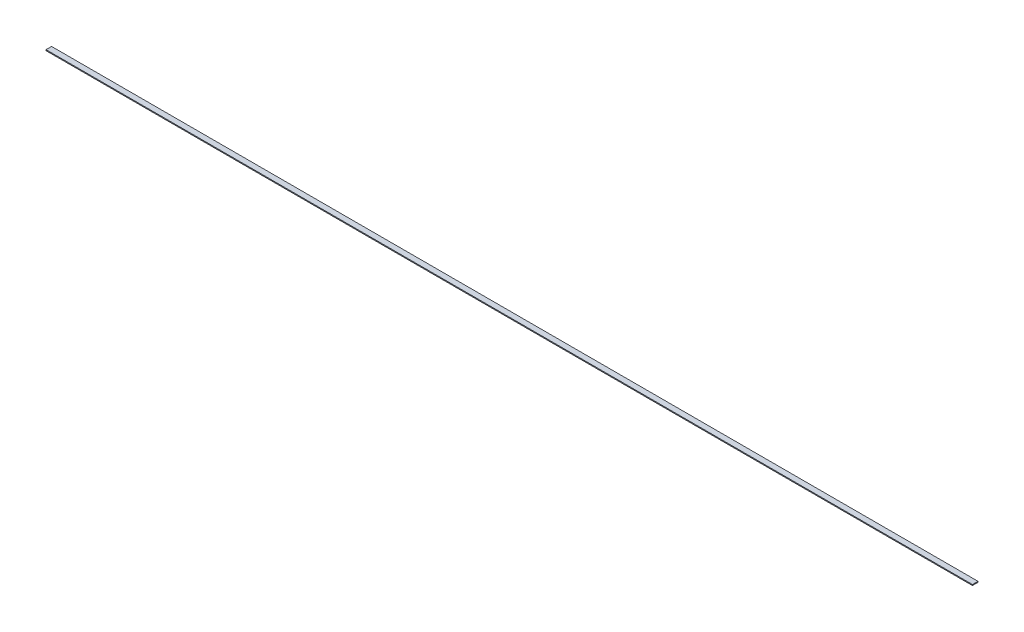
ISO-10303-21;
HEADER;
FILE_DESCRIPTION(('STEP AP214'),'2;1');
FILE_NAME('part.step','',(''),(''),'','','');
FILE_SCHEMA(('AUTOMOTIVE_DESIGN { 1 0 10303 214 1 1 1 1 }'));
ENDSEC;
DATA;
#1=APPLICATION_CONTEXT('core data for automotive mechanical design processes');
#2=APPLICATION_PROTOCOL_DEFINITION('international standard','automotive_design',2000,#1);
#3=PRODUCT_CONTEXT('',#1,'mechanical');
#4=PRODUCT('Part','Part','',(#3));
#5=PRODUCT_RELATED_PRODUCT_CATEGORY('part','',(#4));
#6=PRODUCT_DEFINITION_FORMATION('','',#4);
#7=PRODUCT_DEFINITION_CONTEXT('part definition',#1,'design');
#8=PRODUCT_DEFINITION('design','',#6,#7);
#9=PRODUCT_DEFINITION_SHAPE('','',#8);
#10=(LENGTH_UNIT() NAMED_UNIT(*) SI_UNIT(.MILLI.,.METRE.));
#11=(NAMED_UNIT(*) PLANE_ANGLE_UNIT() SI_UNIT($,.RADIAN.));
#12=(NAMED_UNIT(*) SI_UNIT($,.STERADIAN.) SOLID_ANGLE_UNIT());
#13=UNCERTAINTY_MEASURE_WITH_UNIT(LENGTH_MEASURE(1.E-05),#10,'distance_accuracy_value','');
#14=(GEOMETRIC_REPRESENTATION_CONTEXT(3) GLOBAL_UNCERTAINTY_ASSIGNED_CONTEXT((#13)) GLOBAL_UNIT_ASSIGNED_CONTEXT((#10,
#11,#12)) REPRESENTATION_CONTEXT('',''));
#15=CARTESIAN_POINT('',(0.,0.,0.));
#16=DIRECTION('',(0.,0.,1.));
#17=DIRECTION('',(1.,0.,0.));
#18=AXIS2_PLACEMENT_3D('',#15,#16,#17);
#19=CARTESIAN_POINT('',(0.,0.,6.));
#20=DIRECTION('',(1.,0.,0.));
#21=DIRECTION('',(0.,0.,-1.));
#22=AXIS2_PLACEMENT_3D('',#19,#20,#21);
#23=PLANE('',#22);
#24=DIRECTION('',(0.,-1.,0.));
#25=VECTOR('',#24,1.);
#26=CARTESIAN_POINT('',(0.,0.,0.));
#27=LINE('',#26,#25);
#28=CARTESIAN_POINT('',(0.,1.,0.));
#29=VERTEX_POINT('',#28);
#30=CARTESIAN_POINT('',(0.,0.,0.));
#31=VERTEX_POINT('',#30);
#32=EDGE_CURVE('E96',#29,#31,#27,.T.);
#33=ORIENTED_EDGE('',*,*,#32,.T.);
#34=DIRECTION('',(0.,0.,-1.));
#35=VECTOR('',#34,1.);
#36=CARTESIAN_POINT('',(0.,0.,6.));
#37=LINE('',#36,#35);
#38=CARTESIAN_POINT('',(0.,0.,6.));
#39=VERTEX_POINT('',#38);
#40=EDGE_CURVE('E11',#39,#31,#37,.T.);
#41=ORIENTED_EDGE('',*,*,#40,.F.);
#42=DIRECTION('',(0.,-1.,0.));
#43=VECTOR('',#42,1.);
#44=CARTESIAN_POINT('',(0.,0.,6.));
#45=LINE('',#44,#43);
#46=CARTESIAN_POINT('',(0.,1.,6.));
#47=VERTEX_POINT('',#46);
#48=EDGE_CURVE('E84',#47,#39,#45,.T.);
#49=ORIENTED_EDGE('',*,*,#48,.F.);
#50=DIRECTION('',(0.,0.,-1.));
#51=VECTOR('',#50,1.);
#52=CARTESIAN_POINT('',(0.,1.,6.));
#53=LINE('',#52,#51);
#54=EDGE_CURVE('E92',#47,#29,#53,.T.);
#55=ORIENTED_EDGE('',*,*,#54,.T.);
#56=EDGE_LOOP('',(#33,#41,#49,#55));
#57=FACE_BOUND('',#56,.T.);
#58=ADVANCED_FACE('F33',(#57),#23,.F.);
#59=CARTESIAN_POINT('',(0.,0.,6.));
#60=DIRECTION('',(0.,1.,0.));
#61=DIRECTION('',(0.,0.,1.));
#62=AXIS2_PLACEMENT_3D('',#59,#60,#61);
#63=PLANE('',#62);
#64=DIRECTION('',(1.,0.,0.));
#65=VECTOR('',#64,1.);
#66=CARTESIAN_POINT('',(0.,0.,0.));
#67=LINE('',#66,#65);
#68=CARTESIAN_POINT('',(1000.,0.,0.));
#69=VERTEX_POINT('',#68);
#70=EDGE_CURVE('E88',#31,#69,#67,.T.);
#71=ORIENTED_EDGE('',*,*,#70,.T.);
#72=DIRECTION('',(0.,0.,-1.));
#73=VECTOR('',#72,1.);
#74=CARTESIAN_POINT('',(1000.,0.,6.));
#75=LINE('',#74,#73);
#76=CARTESIAN_POINT('',(1000.,0.,6.));
#77=VERTEX_POINT('',#76);
#78=EDGE_CURVE('E41',#77,#69,#75,.T.);
#79=ORIENTED_EDGE('',*,*,#78,.F.);
#80=DIRECTION('',(1.,0.,0.));
#81=VECTOR('',#80,1.);
#82=CARTESIAN_POINT('',(0.,0.,6.));
#83=LINE('',#82,#81);
#84=EDGE_CURVE('E79',#39,#77,#83,.T.);
#85=ORIENTED_EDGE('',*,*,#84,.F.);
#86=ORIENTED_EDGE('',*,*,#40,.T.);
#87=EDGE_LOOP('',(#71,#79,#85,#86));
#88=FACE_BOUND('',#87,.T.);
#89=ADVANCED_FACE('F87',(#88),#63,.F.);
#90=CARTESIAN_POINT('',(1000.,0.,6.));
#91=DIRECTION('',(-1.,0.,0.));
#92=DIRECTION('',(0.,0.,1.));
#93=AXIS2_PLACEMENT_3D('',#90,#91,#92);
#94=PLANE('',#93);
#95=DIRECTION('',(0.,1.,0.));
#96=VECTOR('',#95,1.);
#97=CARTESIAN_POINT('',(1000.,0.,0.));
#98=LINE('',#97,#96);
#99=CARTESIAN_POINT('',(1000.,1.,0.));
#100=VERTEX_POINT('',#99);
#101=EDGE_CURVE('E66',#69,#100,#98,.T.);
#102=ORIENTED_EDGE('',*,*,#101,.T.);
#103=DIRECTION('',(0.,0.,-1.));
#104=VECTOR('',#103,1.);
#105=CARTESIAN_POINT('',(1000.,1.,6.));
#106=LINE('',#105,#104);
#107=CARTESIAN_POINT('',(1000.,1.,6.));
#108=VERTEX_POINT('',#107);
#109=EDGE_CURVE('E89',#108,#100,#106,.T.);
#110=ORIENTED_EDGE('',*,*,#109,.F.);
#111=DIRECTION('',(0.,1.,0.));
#112=VECTOR('',#111,1.);
#113=CARTESIAN_POINT('',(1000.,0.,6.));
#114=LINE('',#113,#112);
#115=EDGE_CURVE('E82',#77,#108,#114,.T.);
#116=ORIENTED_EDGE('',*,*,#115,.F.);
#117=ORIENTED_EDGE('',*,*,#78,.T.);
#118=EDGE_LOOP('',(#102,#110,#116,#117));
#119=FACE_BOUND('',#118,.T.);
#120=ADVANCED_FACE('F90',(#119),#94,.F.);
#121=CARTESIAN_POINT('',(0.,1.,6.));
#122=DIRECTION('',(0.,-1.,0.));
#123=DIRECTION('',(0.,0.,-1.));
#124=AXIS2_PLACEMENT_3D('',#121,#122,#123);
#125=PLANE('',#124);
#126=DIRECTION('',(-1.,0.,0.));
#127=VECTOR('',#126,1.);
#128=CARTESIAN_POINT('',(0.,1.,0.));
#129=LINE('',#128,#127);
#130=EDGE_CURVE('E72',#100,#29,#129,.T.);
#131=ORIENTED_EDGE('',*,*,#130,.T.);
#132=ORIENTED_EDGE('',*,*,#54,.F.);
#133=DIRECTION('',(-1.,0.,0.));
#134=VECTOR('',#133,1.);
#135=CARTESIAN_POINT('',(0.,1.,6.));
#136=LINE('',#135,#134);
#137=EDGE_CURVE('E49',#108,#47,#136,.T.);
#138=ORIENTED_EDGE('',*,*,#137,.F.);
#139=ORIENTED_EDGE('',*,*,#109,.T.);
#140=EDGE_LOOP('',(#131,#132,#138,#139));
#141=FACE_BOUND('',#140,.T.);
#142=ADVANCED_FACE('F103',(#141),#125,.F.);
#143=CARTESIAN_POINT('',(0.,0.,6.));
#144=DIRECTION('',(0.,0.,-1.));
#145=DIRECTION('',(-1.,0.,0.));
#146=AXIS2_PLACEMENT_3D('',#143,#144,#145);
#147=PLANE('',#146);
#148=ORIENTED_EDGE('',*,*,#48,.T.);
#149=ORIENTED_EDGE('',*,*,#84,.T.);
#150=ORIENTED_EDGE('',*,*,#115,.T.);
#151=ORIENTED_EDGE('',*,*,#137,.T.);
#152=EDGE_LOOP('',(#148,#149,#150,#151));
#153=FACE_BOUND('',#152,.T.);
#154=ADVANCED_FACE('F80',(#153),#147,.F.);
#155=CARTESIAN_POINT('',(0.,0.,0.));
#156=DIRECTION('',(0.,0.,-1.));
#157=DIRECTION('',(-1.,0.,0.));
#158=AXIS2_PLACEMENT_3D('',#155,#156,#157);
#159=PLANE('',#158);
#160=ORIENTED_EDGE('',*,*,#32,.F.);
#161=ORIENTED_EDGE('',*,*,#130,.F.);
#162=ORIENTED_EDGE('',*,*,#101,.F.);
#163=ORIENTED_EDGE('',*,*,#70,.F.);
#164=EDGE_LOOP('',(#160,#161,#162,#163));
#165=FACE_BOUND('',#164,.T.);
#166=ADVANCED_FACE('F106',(#165),#159,.T.);
#167=CLOSED_SHELL('',(#58,#89,#120,#142,#154,#166));
#168=MANIFOLD_SOLID_BREP('B2',#167);
#169=ADVANCED_BREP_SHAPE_REPRESENTATION('',(#18,#168),#14);
#170=SHAPE_DEFINITION_REPRESENTATION(#9,#169);
ENDSEC;
END-ISO-10303-21;
